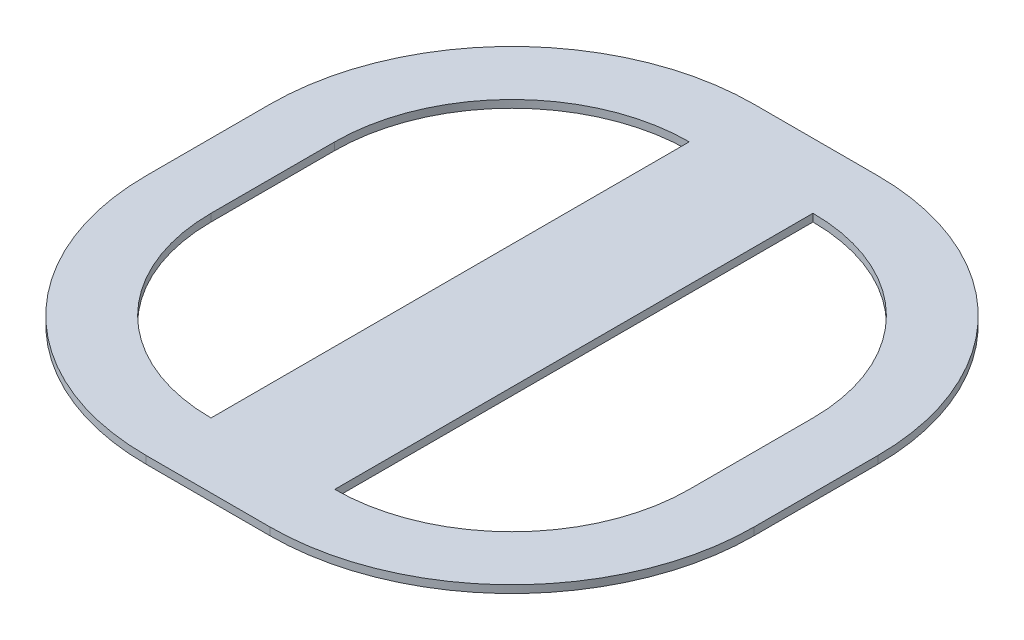
ISO-10303-21;
HEADER;
FILE_DESCRIPTION(('STEP AP214'),'2;1');
FILE_NAME('part.step','',(''),(''),'','','');
FILE_SCHEMA(('AUTOMOTIVE_DESIGN { 1 0 10303 214 1 1 1 1 }'));
ENDSEC;
DATA;
#1=APPLICATION_CONTEXT('core data for automotive mechanical design processes');
#2=APPLICATION_PROTOCOL_DEFINITION('international standard','automotive_design',2000,#1);
#3=PRODUCT_CONTEXT('',#1,'mechanical');
#4=PRODUCT('Part','Part','',(#3));
#5=PRODUCT_RELATED_PRODUCT_CATEGORY('part','',(#4));
#6=PRODUCT_DEFINITION_FORMATION('','',#4);
#7=PRODUCT_DEFINITION_CONTEXT('part definition',#1,'design');
#8=PRODUCT_DEFINITION('design','',#6,#7);
#9=PRODUCT_DEFINITION_SHAPE('','',#8);
#10=(LENGTH_UNIT() NAMED_UNIT(*) SI_UNIT(.MILLI.,.METRE.));
#11=(NAMED_UNIT(*) PLANE_ANGLE_UNIT() SI_UNIT($,.RADIAN.));
#12=(NAMED_UNIT(*) SI_UNIT($,.STERADIAN.) SOLID_ANGLE_UNIT());
#13=UNCERTAINTY_MEASURE_WITH_UNIT(LENGTH_MEASURE(1.E-05),#10,'distance_accuracy_value','');
#14=(GEOMETRIC_REPRESENTATION_CONTEXT(3) GLOBAL_UNCERTAINTY_ASSIGNED_CONTEXT((#13)) GLOBAL_UNIT_ASSIGNED_CONTEXT((#10,
#11,#12)) REPRESENTATION_CONTEXT('',''));
#15=CARTESIAN_POINT('',(0.,0.,0.));
#16=DIRECTION('',(0.,0.,1.));
#17=DIRECTION('',(1.,0.,0.));
#18=AXIS2_PLACEMENT_3D('',#15,#16,#17);
#19=CARTESIAN_POINT('',(37.3,1.175,0.));
#20=DIRECTION('',(0.,-1.,0.));
#21=DIRECTION('',(0.,0.,-1.));
#22=AXIS2_PLACEMENT_3D('',#19,#20,#21);
#23=PLANE('',#22);
#24=CARTESIAN_POINT('',(56.35,1.175,0.));
#25=DIRECTION('',(0.,1.,0.));
#26=DIRECTION('',(0.,0.,-1.));
#27=AXIS2_PLACEMENT_3D('',#24,#25,#26);
#28=CIRCLE('',#27,27.3);
#29=CARTESIAN_POINT('',(56.35,1.175,27.3));
#30=VERTEX_POINT('',#29);
#31=CARTESIAN_POINT('',(83.65,1.175,0.));
#32=VERTEX_POINT('',#31);
#33=EDGE_CURVE('E449',#30,#32,#28,.T.);
#34=ORIENTED_EDGE('',*,*,#33,.F.);
#35=DIRECTION('',(0.,0.,-1.));
#36=VECTOR('',#35,1.);
#37=CARTESIAN_POINT('',(56.35,1.175,46.3862024771823));
#38=LINE('',#37,#36);
#39=CARTESIAN_POINT('',(56.35,1.175,-46.35));
#40=VERTEX_POINT('',#39);
#41=EDGE_CURVE('E439',#30,#40,#38,.T.);
#42=ORIENTED_EDGE('',*,*,#41,.T.);
#43=CARTESIAN_POINT('',(56.35,1.175,-19.05));
#44=DIRECTION('',(0.,1.,0.));
#45=DIRECTION('',(0.,0.,-1.));
#46=AXIS2_PLACEMENT_3D('',#43,#44,#45);
#47=CIRCLE('',#46,27.3);
#48=CARTESIAN_POINT('',(83.65,1.175,-19.05));
#49=VERTEX_POINT('',#48);
#50=EDGE_CURVE('E453',#49,#40,#47,.T.);
#51=ORIENTED_EDGE('',*,*,#50,.F.);
#52=DIRECTION('',(0.,0.,-1.));
#53=VECTOR('',#52,1.);
#54=CARTESIAN_POINT('',(83.65,1.175,-19.05));
#55=LINE('',#54,#53);
#56=EDGE_CURVE('E451',#32,#49,#55,.T.);
#57=ORIENTED_EDGE('',*,*,#56,.F.);
#58=EDGE_LOOP('',(#34,#42,#51,#57));
#59=FACE_BOUND('',#58,.T.);
#60=CARTESIAN_POINT('',(37.3,1.175,0.));
#61=DIRECTION('',(0.,1.,0.));
#62=DIRECTION('',(0.,0.,-1.));
#63=AXIS2_PLACEMENT_3D('',#60,#61,#62);
#64=CIRCLE('',#63,37.3);
#65=CARTESIAN_POINT('',(0.,1.175,0.));
#66=VERTEX_POINT('',#65);
#67=CARTESIAN_POINT('',(37.3,1.175,37.3));
#68=VERTEX_POINT('',#67);
#69=EDGE_CURVE('E184',#66,#68,#64,.T.);
#70=ORIENTED_EDGE('',*,*,#69,.T.);
#71=DIRECTION('',(1.,0.,0.));
#72=VECTOR('',#71,1.);
#73=CARTESIAN_POINT('',(56.35,1.175,37.3));
#74=LINE('',#73,#72);
#75=CARTESIAN_POINT('',(56.35,1.175,37.3));
#76=VERTEX_POINT('',#75);
#77=EDGE_CURVE('E187',#68,#76,#74,.T.);
#78=ORIENTED_EDGE('',*,*,#77,.T.);
#79=CARTESIAN_POINT('',(56.35,1.175,0.));
#80=DIRECTION('',(0.,1.,0.));
#81=DIRECTION('',(0.,0.,-1.));
#82=AXIS2_PLACEMENT_3D('',#79,#80,#81);
#83=CIRCLE('',#82,37.3);
#84=CARTESIAN_POINT('',(93.65,1.175,0.));
#85=VERTEX_POINT('',#84);
#86=EDGE_CURVE('E190',#76,#85,#83,.T.);
#87=ORIENTED_EDGE('',*,*,#86,.T.);
#88=DIRECTION('',(0.,0.,-1.));
#89=VECTOR('',#88,1.);
#90=CARTESIAN_POINT('',(93.65,1.175,-19.05));
#91=LINE('',#90,#89);
#92=CARTESIAN_POINT('',(93.65,1.175,-19.05));
#93=VERTEX_POINT('',#92);
#94=EDGE_CURVE('E192',#85,#93,#91,.T.);
#95=ORIENTED_EDGE('',*,*,#94,.T.);
#96=CARTESIAN_POINT('',(56.35,1.175,-19.05));
#97=DIRECTION('',(0.,1.,0.));
#98=DIRECTION('',(0.,0.,-1.));
#99=AXIS2_PLACEMENT_3D('',#96,#97,#98);
#100=CIRCLE('',#99,37.3);
#101=CARTESIAN_POINT('',(56.35,1.175,-56.35));
#102=VERTEX_POINT('',#101);
#103=EDGE_CURVE('E194',#93,#102,#100,.T.);
#104=ORIENTED_EDGE('',*,*,#103,.T.);
#105=DIRECTION('',(-1.,0.,0.));
#106=VECTOR('',#105,1.);
#107=CARTESIAN_POINT('',(37.3,1.175,-56.35));
#108=LINE('',#107,#106);
#109=CARTESIAN_POINT('',(37.3,1.175,-56.35));
#110=VERTEX_POINT('',#109);
#111=EDGE_CURVE('E196',#102,#110,#108,.T.);
#112=ORIENTED_EDGE('',*,*,#111,.T.);
#113=CARTESIAN_POINT('',(37.3,1.175,-19.05));
#114=DIRECTION('',(0.,1.,0.));
#115=DIRECTION('',(0.,0.,-1.));
#116=AXIS2_PLACEMENT_3D('',#113,#114,#115);
#117=CIRCLE('',#116,37.3);
#118=CARTESIAN_POINT('',(0.,1.175,-19.05));
#119=VERTEX_POINT('',#118);
#120=EDGE_CURVE('E198',#110,#119,#117,.T.);
#121=ORIENTED_EDGE('',*,*,#120,.T.);
#122=DIRECTION('',(0.,0.,1.));
#123=VECTOR('',#122,1.);
#124=CARTESIAN_POINT('',(0.,1.175,0.));
#125=LINE('',#124,#123);
#126=EDGE_CURVE('E200',#119,#66,#125,.T.);
#127=ORIENTED_EDGE('',*,*,#126,.T.);
#128=EDGE_LOOP('',(#70,#78,#87,#95,#104,#112,#121,#127));
#129=FACE_BOUND('',#128,.T.);
#130=CARTESIAN_POINT('',(37.3,1.175,0.));
#131=DIRECTION('',(0.,1.,0.));
#132=DIRECTION('',(0.,0.,-1.));
#133=AXIS2_PLACEMENT_3D('',#130,#131,#132);
#134=CIRCLE('',#133,27.3);
#135=CARTESIAN_POINT('',(10.,1.175,0.));
#136=VERTEX_POINT('',#135);
#137=CARTESIAN_POINT('',(37.3,1.175,27.3));
#138=VERTEX_POINT('',#137);
#139=EDGE_CURVE('E447',#136,#138,#134,.T.);
#140=ORIENTED_EDGE('',*,*,#139,.F.);
#141=DIRECTION('',(0.,0.,1.));
#142=VECTOR('',#141,1.);
#143=CARTESIAN_POINT('',(10.,1.175,0.));
#144=LINE('',#143,#142);
#145=CARTESIAN_POINT('',(10.,1.175,-19.05));
#146=VERTEX_POINT('',#145);
#147=EDGE_CURVE('E457',#146,#136,#144,.T.);
#148=ORIENTED_EDGE('',*,*,#147,.F.);
#149=CARTESIAN_POINT('',(37.3,1.175,-19.05));
#150=DIRECTION('',(0.,1.,0.));
#151=DIRECTION('',(0.,0.,-1.));
#152=AXIS2_PLACEMENT_3D('',#149,#150,#151);
#153=CIRCLE('',#152,27.3);
#154=CARTESIAN_POINT('',(37.3,1.175,-46.35));
#155=VERTEX_POINT('',#154);
#156=EDGE_CURVE('E455',#155,#146,#153,.T.);
#157=ORIENTED_EDGE('',*,*,#156,.F.);
#158=DIRECTION('',(0.,0.,-1.));
#159=VECTOR('',#158,1.);
#160=CARTESIAN_POINT('',(37.3,1.175,46.3862024771823));
#161=LINE('',#160,#159);
#162=EDGE_CURVE('E162',#138,#155,#161,.T.);
#163=ORIENTED_EDGE('',*,*,#162,.F.);
#164=EDGE_LOOP('',(#140,#148,#157,#163));
#165=FACE_BOUND('',#164,.T.);
#166=ADVANCED_FACE('F33',(#59,#129,#165),#23,.F.);
#167=CARTESIAN_POINT('',(37.3,0.,0.));
#168=DIRECTION('',(0.,-1.,0.));
#169=DIRECTION('',(0.,0.,-1.));
#170=AXIS2_PLACEMENT_3D('',#167,#168,#169);
#171=PLANE('',#170);
#172=DIRECTION('',(0.,0.,-1.));
#173=VECTOR('',#172,1.);
#174=CARTESIAN_POINT('',(56.35,0.,46.3862024771823));
#175=LINE('',#174,#173);
#176=CARTESIAN_POINT('',(56.35,0.,27.3));
#177=VERTEX_POINT('',#176);
#178=CARTESIAN_POINT('',(56.35,0.,-46.35));
#179=VERTEX_POINT('',#178);
#180=EDGE_CURVE('E442',#177,#179,#175,.T.);
#181=ORIENTED_EDGE('',*,*,#180,.F.);
#182=CARTESIAN_POINT('',(56.35,0.,0.));
#183=DIRECTION('',(0.,1.,0.));
#184=DIRECTION('',(0.,0.,-1.));
#185=AXIS2_PLACEMENT_3D('',#182,#183,#184);
#186=CIRCLE('',#185,27.3);
#187=CARTESIAN_POINT('',(83.65,0.,0.));
#188=VERTEX_POINT('',#187);
#189=EDGE_CURVE('E460',#177,#188,#186,.T.);
#190=ORIENTED_EDGE('',*,*,#189,.T.);
#191=DIRECTION('',(0.,0.,-1.));
#192=VECTOR('',#191,1.);
#193=CARTESIAN_POINT('',(83.65,0.,-19.05));
#194=LINE('',#193,#192);
#195=CARTESIAN_POINT('',(83.65,0.,-19.05));
#196=VERTEX_POINT('',#195);
#197=EDGE_CURVE('E463',#188,#196,#194,.T.);
#198=ORIENTED_EDGE('',*,*,#197,.T.);
#199=CARTESIAN_POINT('',(56.35,0.,-19.05));
#200=DIRECTION('',(0.,1.,0.));
#201=DIRECTION('',(0.,0.,-1.));
#202=AXIS2_PLACEMENT_3D('',#199,#200,#201);
#203=CIRCLE('',#202,27.3);
#204=EDGE_CURVE('E155',#196,#179,#203,.T.);
#205=ORIENTED_EDGE('',*,*,#204,.T.);
#206=EDGE_LOOP('',(#181,#190,#198,#205));
#207=FACE_BOUND('',#206,.T.);
#208=CARTESIAN_POINT('',(37.3,0.,0.));
#209=DIRECTION('',(0.,1.,0.));
#210=DIRECTION('',(0.,0.,-1.));
#211=AXIS2_PLACEMENT_3D('',#208,#209,#210);
#212=CIRCLE('',#211,37.3);
#213=CARTESIAN_POINT('',(0.,0.,0.));
#214=VERTEX_POINT('',#213);
#215=CARTESIAN_POINT('',(37.3,0.,37.3));
#216=VERTEX_POINT('',#215);
#217=EDGE_CURVE('E183',#214,#216,#212,.T.);
#218=ORIENTED_EDGE('',*,*,#217,.F.);
#219=DIRECTION('',(0.,0.,1.));
#220=VECTOR('',#219,1.);
#221=CARTESIAN_POINT('',(0.,0.,0.));
#222=LINE('',#221,#220);
#223=CARTESIAN_POINT('',(0.,0.,-19.05));
#224=VERTEX_POINT('',#223);
#225=EDGE_CURVE('E188',#224,#214,#222,.T.);
#226=ORIENTED_EDGE('',*,*,#225,.F.);
#227=CARTESIAN_POINT('',(37.3,0.,-19.05));
#228=DIRECTION('',(0.,1.,0.));
#229=DIRECTION('',(0.,0.,-1.));
#230=AXIS2_PLACEMENT_3D('',#227,#228,#229);
#231=CIRCLE('',#230,37.3);
#232=CARTESIAN_POINT('',(37.3,0.,-56.35));
#233=VERTEX_POINT('',#232);
#234=EDGE_CURVE('E215',#233,#224,#231,.T.);
#235=ORIENTED_EDGE('',*,*,#234,.F.);
#236=DIRECTION('',(-1.,0.,0.));
#237=VECTOR('',#236,1.);
#238=CARTESIAN_POINT('',(37.3,0.,-56.35));
#239=LINE('',#238,#237);
#240=CARTESIAN_POINT('',(56.35,0.,-56.35));
#241=VERTEX_POINT('',#240);
#242=EDGE_CURVE('E213',#241,#233,#239,.T.);
#243=ORIENTED_EDGE('',*,*,#242,.F.);
#244=CARTESIAN_POINT('',(56.35,0.,-19.05));
#245=DIRECTION('',(0.,1.,0.));
#246=DIRECTION('',(0.,0.,-1.));
#247=AXIS2_PLACEMENT_3D('',#244,#245,#246);
#248=CIRCLE('',#247,37.3);
#249=CARTESIAN_POINT('',(93.65,0.,-19.05));
#250=VERTEX_POINT('',#249);
#251=EDGE_CURVE('E211',#250,#241,#248,.T.);
#252=ORIENTED_EDGE('',*,*,#251,.F.);
#253=DIRECTION('',(0.,0.,-1.));
#254=VECTOR('',#253,1.);
#255=CARTESIAN_POINT('',(93.65,0.,-19.05));
#256=LINE('',#255,#254);
#257=CARTESIAN_POINT('',(93.65,0.,0.));
#258=VERTEX_POINT('',#257);
#259=EDGE_CURVE('E209',#258,#250,#256,.T.);
#260=ORIENTED_EDGE('',*,*,#259,.F.);
#261=CARTESIAN_POINT('',(56.35,0.,0.));
#262=DIRECTION('',(0.,1.,0.));
#263=DIRECTION('',(0.,0.,-1.));
#264=AXIS2_PLACEMENT_3D('',#261,#262,#263);
#265=CIRCLE('',#264,37.3);
#266=CARTESIAN_POINT('',(56.35,0.,37.3));
#267=VERTEX_POINT('',#266);
#268=EDGE_CURVE('E207',#267,#258,#265,.T.);
#269=ORIENTED_EDGE('',*,*,#268,.F.);
#270=DIRECTION('',(1.,0.,0.));
#271=VECTOR('',#270,1.);
#272=CARTESIAN_POINT('',(56.35,0.,37.3));
#273=LINE('',#272,#271);
#274=EDGE_CURVE('E205',#216,#267,#273,.T.);
#275=ORIENTED_EDGE('',*,*,#274,.F.);
#276=EDGE_LOOP('',(#218,#226,#235,#243,#252,#260,#269,#275));
#277=FACE_BOUND('',#276,.T.);
#278=DIRECTION('',(0.,0.,1.));
#279=VECTOR('',#278,1.);
#280=CARTESIAN_POINT('',(10.,0.,0.));
#281=LINE('',#280,#279);
#282=CARTESIAN_POINT('',(10.,0.,-19.05));
#283=VERTEX_POINT('',#282);
#284=CARTESIAN_POINT('',(10.,0.,0.));
#285=VERTEX_POINT('',#284);
#286=EDGE_CURVE('E154',#283,#285,#281,.T.);
#287=ORIENTED_EDGE('',*,*,#286,.T.);
#288=CARTESIAN_POINT('',(37.3,0.,0.));
#289=DIRECTION('',(0.,1.,0.));
#290=DIRECTION('',(0.,0.,-1.));
#291=AXIS2_PLACEMENT_3D('',#288,#289,#290);
#292=CIRCLE('',#291,27.3);
#293=CARTESIAN_POINT('',(37.3,0.,27.3));
#294=VERTEX_POINT('',#293);
#295=EDGE_CURVE('E56',#285,#294,#292,.T.);
#296=ORIENTED_EDGE('',*,*,#295,.T.);
#297=DIRECTION('',(0.,0.,-1.));
#298=VECTOR('',#297,1.);
#299=CARTESIAN_POINT('',(37.3,0.,46.3862024771823));
#300=LINE('',#299,#298);
#301=CARTESIAN_POINT('',(37.3,0.,-46.35));
#302=VERTEX_POINT('',#301);
#303=EDGE_CURVE('E158',#294,#302,#300,.T.);
#304=ORIENTED_EDGE('',*,*,#303,.T.);
#305=CARTESIAN_POINT('',(37.3,0.,-19.05));
#306=DIRECTION('',(0.,1.,0.));
#307=DIRECTION('',(0.,0.,-1.));
#308=AXIS2_PLACEMENT_3D('',#305,#306,#307);
#309=CIRCLE('',#308,27.3);
#310=EDGE_CURVE('E146',#302,#283,#309,.T.);
#311=ORIENTED_EDGE('',*,*,#310,.T.);
#312=EDGE_LOOP('',(#287,#296,#304,#311));
#313=FACE_BOUND('',#312,.T.);
#314=ADVANCED_FACE('F159',(#207,#277,#313),#171,.T.);
#315=CARTESIAN_POINT('',(37.3,1.175,0.));
#316=DIRECTION('',(0.,-1.,0.));
#317=DIRECTION('',(0.,0.,-1.));
#318=AXIS2_PLACEMENT_3D('',#315,#316,#317);
#319=CYLINDRICAL_SURFACE('',#318,37.3);
#320=ORIENTED_EDGE('',*,*,#217,.T.);
#321=DIRECTION('',(0.,-1.,0.));
#322=VECTOR('',#321,1.);
#323=CARTESIAN_POINT('',(37.3,1.175,37.3));
#324=LINE('',#323,#322);
#325=EDGE_CURVE('E11',#68,#216,#324,.T.);
#326=ORIENTED_EDGE('',*,*,#325,.F.);
#327=ORIENTED_EDGE('',*,*,#69,.F.);
#328=DIRECTION('',(0.,-1.,0.));
#329=VECTOR('',#328,1.);
#330=CARTESIAN_POINT('',(0.,1.175,0.));
#331=LINE('',#330,#329);
#332=EDGE_CURVE('E202',#66,#214,#331,.T.);
#333=ORIENTED_EDGE('',*,*,#332,.T.);
#334=EDGE_LOOP('',(#320,#326,#327,#333));
#335=FACE_BOUND('',#334,.T.);
#336=ADVANCED_FACE('F35',(#335),#319,.T.);
#337=CARTESIAN_POINT('',(56.35,1.175,37.3));
#338=DIRECTION('',(0.,0.,-1.));
#339=DIRECTION('',(-1.,0.,0.));
#340=AXIS2_PLACEMENT_3D('',#337,#338,#339);
#341=PLANE('',#340);
#342=ORIENTED_EDGE('',*,*,#274,.T.);
#343=DIRECTION('',(0.,-1.,0.));
#344=VECTOR('',#343,1.);
#345=CARTESIAN_POINT('',(56.35,1.175,37.3));
#346=LINE('',#345,#344);
#347=EDGE_CURVE('E41',#76,#267,#346,.T.);
#348=ORIENTED_EDGE('',*,*,#347,.F.);
#349=ORIENTED_EDGE('',*,*,#77,.F.);
#350=ORIENTED_EDGE('',*,*,#325,.T.);
#351=EDGE_LOOP('',(#342,#348,#349,#350));
#352=FACE_BOUND('',#351,.T.);
#353=ADVANCED_FACE('F261',(#352),#341,.F.);
#354=CARTESIAN_POINT('',(56.35,1.175,0.));
#355=DIRECTION('',(0.,-1.,0.));
#356=DIRECTION('',(0.,0.,-1.));
#357=AXIS2_PLACEMENT_3D('',#354,#355,#356);
#358=CYLINDRICAL_SURFACE('',#357,37.3);
#359=ORIENTED_EDGE('',*,*,#268,.T.);
#360=DIRECTION('',(0.,-1.,0.));
#361=VECTOR('',#360,1.);
#362=CARTESIAN_POINT('',(93.65,1.175,0.));
#363=LINE('',#362,#361);
#364=EDGE_CURVE('E232',#85,#258,#363,.T.);
#365=ORIENTED_EDGE('',*,*,#364,.F.);
#366=ORIENTED_EDGE('',*,*,#86,.F.);
#367=ORIENTED_EDGE('',*,*,#347,.T.);
#368=EDGE_LOOP('',(#359,#365,#366,#367));
#369=FACE_BOUND('',#368,.T.);
#370=ADVANCED_FACE('F239',(#369),#358,.T.);
#371=CARTESIAN_POINT('',(93.65,1.175,-19.05));
#372=DIRECTION('',(-1.,0.,0.));
#373=DIRECTION('',(0.,0.,1.));
#374=AXIS2_PLACEMENT_3D('',#371,#372,#373);
#375=PLANE('',#374);
#376=ORIENTED_EDGE('',*,*,#259,.T.);
#377=DIRECTION('',(0.,-1.,0.));
#378=VECTOR('',#377,1.);
#379=CARTESIAN_POINT('',(93.65,1.175,-19.05));
#380=LINE('',#379,#378);
#381=EDGE_CURVE('E229',#93,#250,#380,.T.);
#382=ORIENTED_EDGE('',*,*,#381,.F.);
#383=ORIENTED_EDGE('',*,*,#94,.F.);
#384=ORIENTED_EDGE('',*,*,#364,.T.);
#385=EDGE_LOOP('',(#376,#382,#383,#384));
#386=FACE_BOUND('',#385,.T.);
#387=ADVANCED_FACE('F249',(#386),#375,.F.);
#388=CARTESIAN_POINT('',(56.35,1.175,-19.05));
#389=DIRECTION('',(0.,-1.,0.));
#390=DIRECTION('',(0.,0.,-1.));
#391=AXIS2_PLACEMENT_3D('',#388,#389,#390);
#392=CYLINDRICAL_SURFACE('',#391,37.3);
#393=ORIENTED_EDGE('',*,*,#251,.T.);
#394=DIRECTION('',(0.,-1.,0.));
#395=VECTOR('',#394,1.);
#396=CARTESIAN_POINT('',(56.35,1.175,-56.35));
#397=LINE('',#396,#395);
#398=EDGE_CURVE('E226',#102,#241,#397,.T.);
#399=ORIENTED_EDGE('',*,*,#398,.F.);
#400=ORIENTED_EDGE('',*,*,#103,.F.);
#401=ORIENTED_EDGE('',*,*,#381,.T.);
#402=EDGE_LOOP('',(#393,#399,#400,#401));
#403=FACE_BOUND('',#402,.T.);
#404=ADVANCED_FACE('F253',(#403),#392,.T.);
#405=CARTESIAN_POINT('',(37.3,1.175,-56.35));
#406=DIRECTION('',(0.,0.,1.));
#407=DIRECTION('',(1.,0.,0.));
#408=AXIS2_PLACEMENT_3D('',#405,#406,#407);
#409=PLANE('',#408);
#410=ORIENTED_EDGE('',*,*,#242,.T.);
#411=DIRECTION('',(0.,-1.,0.));
#412=VECTOR('',#411,1.);
#413=CARTESIAN_POINT('',(37.3,1.175,-56.35));
#414=LINE('',#413,#412);
#415=EDGE_CURVE('E223',#110,#233,#414,.T.);
#416=ORIENTED_EDGE('',*,*,#415,.F.);
#417=ORIENTED_EDGE('',*,*,#111,.F.);
#418=ORIENTED_EDGE('',*,*,#398,.T.);
#419=EDGE_LOOP('',(#410,#416,#417,#418));
#420=FACE_BOUND('',#419,.T.);
#421=ADVANCED_FACE('F274',(#420),#409,.F.);
#422=CARTESIAN_POINT('',(37.3,1.175,-19.05));
#423=DIRECTION('',(0.,-1.,0.));
#424=DIRECTION('',(0.,0.,-1.));
#425=AXIS2_PLACEMENT_3D('',#422,#423,#424);
#426=CYLINDRICAL_SURFACE('',#425,37.3);
#427=ORIENTED_EDGE('',*,*,#234,.T.);
#428=DIRECTION('',(0.,-1.,0.));
#429=VECTOR('',#428,1.);
#430=CARTESIAN_POINT('',(0.,1.175,-19.05));
#431=LINE('',#430,#429);
#432=EDGE_CURVE('E220',#119,#224,#431,.T.);
#433=ORIENTED_EDGE('',*,*,#432,.F.);
#434=ORIENTED_EDGE('',*,*,#120,.F.);
#435=ORIENTED_EDGE('',*,*,#415,.T.);
#436=EDGE_LOOP('',(#427,#433,#434,#435));
#437=FACE_BOUND('',#436,.T.);
#438=ADVANCED_FACE('F272',(#437),#426,.T.);
#439=CARTESIAN_POINT('',(0.,1.175,0.));
#440=DIRECTION('',(1.,0.,0.));
#441=DIRECTION('',(0.,0.,-1.));
#442=AXIS2_PLACEMENT_3D('',#439,#440,#441);
#443=PLANE('',#442);
#444=ORIENTED_EDGE('',*,*,#225,.T.);
#445=ORIENTED_EDGE('',*,*,#332,.F.);
#446=ORIENTED_EDGE('',*,*,#126,.F.);
#447=ORIENTED_EDGE('',*,*,#432,.T.);
#448=EDGE_LOOP('',(#444,#445,#446,#447));
#449=FACE_BOUND('',#448,.T.);
#450=ADVANCED_FACE('F267',(#449),#443,.F.);
#451=CARTESIAN_POINT('',(37.3,1.175,0.));
#452=DIRECTION('',(0.,-1.,0.));
#453=DIRECTION('',(0.,0.,-1.));
#454=AXIS2_PLACEMENT_3D('',#451,#452,#453);
#455=CYLINDRICAL_SURFACE('',#454,27.3);
#456=ORIENTED_EDGE('',*,*,#295,.F.);
#457=DIRECTION('',(0.,-1.,0.));
#458=VECTOR('',#457,1.);
#459=CARTESIAN_POINT('',(10.,1.175,0.));
#460=LINE('',#459,#458);
#461=EDGE_CURVE('E171',#136,#285,#460,.T.);
#462=ORIENTED_EDGE('',*,*,#461,.F.);
#463=ORIENTED_EDGE('',*,*,#139,.T.);
#464=DIRECTION('',(0.,-1.,0.));
#465=VECTOR('',#464,1.);
#466=CARTESIAN_POINT('',(37.3,1.175,27.3));
#467=LINE('',#466,#465);
#468=EDGE_CURVE('E181',#138,#294,#467,.T.);
#469=ORIENTED_EDGE('',*,*,#468,.T.);
#470=EDGE_LOOP('',(#456,#462,#463,#469));
#471=FACE_BOUND('',#470,.T.);
#472=ADVANCED_FACE('F293',(#471),#455,.F.);
#473=CARTESIAN_POINT('',(56.35,1.175,0.));
#474=DIRECTION('',(0.,-1.,0.));
#475=DIRECTION('',(0.,0.,-1.));
#476=AXIS2_PLACEMENT_3D('',#473,#474,#475);
#477=CYLINDRICAL_SURFACE('',#476,27.3);
#478=ORIENTED_EDGE('',*,*,#189,.F.);
#479=DIRECTION('',(0.,-1.,0.));
#480=VECTOR('',#479,1.);
#481=CARTESIAN_POINT('',(56.35,1.175,27.3));
#482=LINE('',#481,#480);
#483=EDGE_CURVE('E178',#30,#177,#482,.T.);
#484=ORIENTED_EDGE('',*,*,#483,.F.);
#485=ORIENTED_EDGE('',*,*,#33,.T.);
#486=DIRECTION('',(0.,-1.,0.));
#487=VECTOR('',#486,1.);
#488=CARTESIAN_POINT('',(83.65,1.175,0.));
#489=LINE('',#488,#487);
#490=EDGE_CURVE('E176',#32,#188,#489,.T.);
#491=ORIENTED_EDGE('',*,*,#490,.T.);
#492=EDGE_LOOP('',(#478,#484,#485,#491));
#493=FACE_BOUND('',#492,.T.);
#494=ADVANCED_FACE('F300',(#493),#477,.F.);
#495=CARTESIAN_POINT('',(83.65,1.175,-19.05));
#496=DIRECTION('',(-1.,0.,0.));
#497=DIRECTION('',(0.,0.,1.));
#498=AXIS2_PLACEMENT_3D('',#495,#496,#497);
#499=PLANE('',#498);
#500=ORIENTED_EDGE('',*,*,#197,.F.);
#501=ORIENTED_EDGE('',*,*,#490,.F.);
#502=ORIENTED_EDGE('',*,*,#56,.T.);
#503=DIRECTION('',(0.,-1.,0.));
#504=VECTOR('',#503,1.);
#505=CARTESIAN_POINT('',(83.65,1.175,-19.05));
#506=LINE('',#505,#504);
#507=EDGE_CURVE('E169',#49,#196,#506,.T.);
#508=ORIENTED_EDGE('',*,*,#507,.T.);
#509=EDGE_LOOP('',(#500,#501,#502,#508));
#510=FACE_BOUND('',#509,.T.);
#511=ADVANCED_FACE('F304',(#510),#499,.T.);
#512=CARTESIAN_POINT('',(56.35,1.175,-19.05));
#513=DIRECTION('',(0.,-1.,0.));
#514=DIRECTION('',(0.,0.,-1.));
#515=AXIS2_PLACEMENT_3D('',#512,#513,#514);
#516=CYLINDRICAL_SURFACE('',#515,27.3);
#517=ORIENTED_EDGE('',*,*,#204,.F.);
#518=ORIENTED_EDGE('',*,*,#507,.F.);
#519=ORIENTED_EDGE('',*,*,#50,.T.);
#520=DIRECTION('',(0.,-1.,0.));
#521=VECTOR('',#520,1.);
#522=CARTESIAN_POINT('',(56.35,1.175,-46.35));
#523=LINE('',#522,#521);
#524=EDGE_CURVE('E167',#40,#179,#523,.T.);
#525=ORIENTED_EDGE('',*,*,#524,.T.);
#526=EDGE_LOOP('',(#517,#518,#519,#525));
#527=FACE_BOUND('',#526,.T.);
#528=ADVANCED_FACE('F309',(#527),#516,.F.);
#529=CARTESIAN_POINT('',(37.3,1.175,-19.05));
#530=DIRECTION('',(0.,-1.,0.));
#531=DIRECTION('',(0.,0.,-1.));
#532=AXIS2_PLACEMENT_3D('',#529,#530,#531);
#533=CYLINDRICAL_SURFACE('',#532,27.3);
#534=ORIENTED_EDGE('',*,*,#310,.F.);
#535=DIRECTION('',(0.,-1.,0.));
#536=VECTOR('',#535,1.);
#537=CARTESIAN_POINT('',(37.3,1.175,-46.35));
#538=LINE('',#537,#536);
#539=EDGE_CURVE('E150',#155,#302,#538,.T.);
#540=ORIENTED_EDGE('',*,*,#539,.F.);
#541=ORIENTED_EDGE('',*,*,#156,.T.);
#542=DIRECTION('',(0.,-1.,0.));
#543=VECTOR('',#542,1.);
#544=CARTESIAN_POINT('',(10.,1.175,-19.05));
#545=LINE('',#544,#543);
#546=EDGE_CURVE('E48',#146,#283,#545,.T.);
#547=ORIENTED_EDGE('',*,*,#546,.T.);
#548=EDGE_LOOP('',(#534,#540,#541,#547));
#549=FACE_BOUND('',#548,.T.);
#550=ADVANCED_FACE('F148',(#549),#533,.F.);
#551=CARTESIAN_POINT('',(10.,1.175,0.));
#552=DIRECTION('',(1.,0.,0.));
#553=DIRECTION('',(0.,0.,-1.));
#554=AXIS2_PLACEMENT_3D('',#551,#552,#553);
#555=PLANE('',#554);
#556=ORIENTED_EDGE('',*,*,#286,.F.);
#557=ORIENTED_EDGE('',*,*,#546,.F.);
#558=ORIENTED_EDGE('',*,*,#147,.T.);
#559=ORIENTED_EDGE('',*,*,#461,.T.);
#560=EDGE_LOOP('',(#556,#557,#558,#559));
#561=FACE_BOUND('',#560,.T.);
#562=ADVANCED_FACE('F318',(#561),#555,.T.);
#563=CARTESIAN_POINT('',(37.3,0.,46.3862024771823));
#564=DIRECTION('',(1.,0.,0.));
#565=DIRECTION('',(0.,0.,-1.));
#566=AXIS2_PLACEMENT_3D('',#563,#564,#565);
#567=PLANE('',#566);
#568=ORIENTED_EDGE('',*,*,#303,.F.);
#569=ORIENTED_EDGE('',*,*,#468,.F.);
#570=ORIENTED_EDGE('',*,*,#162,.T.);
#571=ORIENTED_EDGE('',*,*,#539,.T.);
#572=EDGE_LOOP('',(#568,#569,#570,#571));
#573=FACE_BOUND('',#572,.T.);
#574=ADVANCED_FACE('F165',(#573),#567,.F.);
#575=CARTESIAN_POINT('',(56.35,1.175,46.3862024771823));
#576=DIRECTION('',(-1.,0.,0.));
#577=DIRECTION('',(0.,0.,1.));
#578=AXIS2_PLACEMENT_3D('',#575,#576,#577);
#579=PLANE('',#578);
#580=ORIENTED_EDGE('',*,*,#41,.F.);
#581=ORIENTED_EDGE('',*,*,#483,.T.);
#582=ORIENTED_EDGE('',*,*,#180,.T.);
#583=ORIENTED_EDGE('',*,*,#524,.F.);
#584=EDGE_LOOP('',(#580,#581,#582,#583));
#585=FACE_BOUND('',#584,.T.);
#586=ADVANCED_FACE('F321',(#585),#579,.F.);
#587=CLOSED_SHELL('',(#166,#314,#336,#353,#370,#387,#404,#421,#438,#450,#472,#494,#511,#528,
#550,#562,#574,#586));
#588=MANIFOLD_SOLID_BREP('B2',#587);
#589=ADVANCED_BREP_SHAPE_REPRESENTATION('',(#18,#588),#14);
#590=SHAPE_DEFINITION_REPRESENTATION(#9,#589);
ENDSEC;
END-ISO-10303-21;
